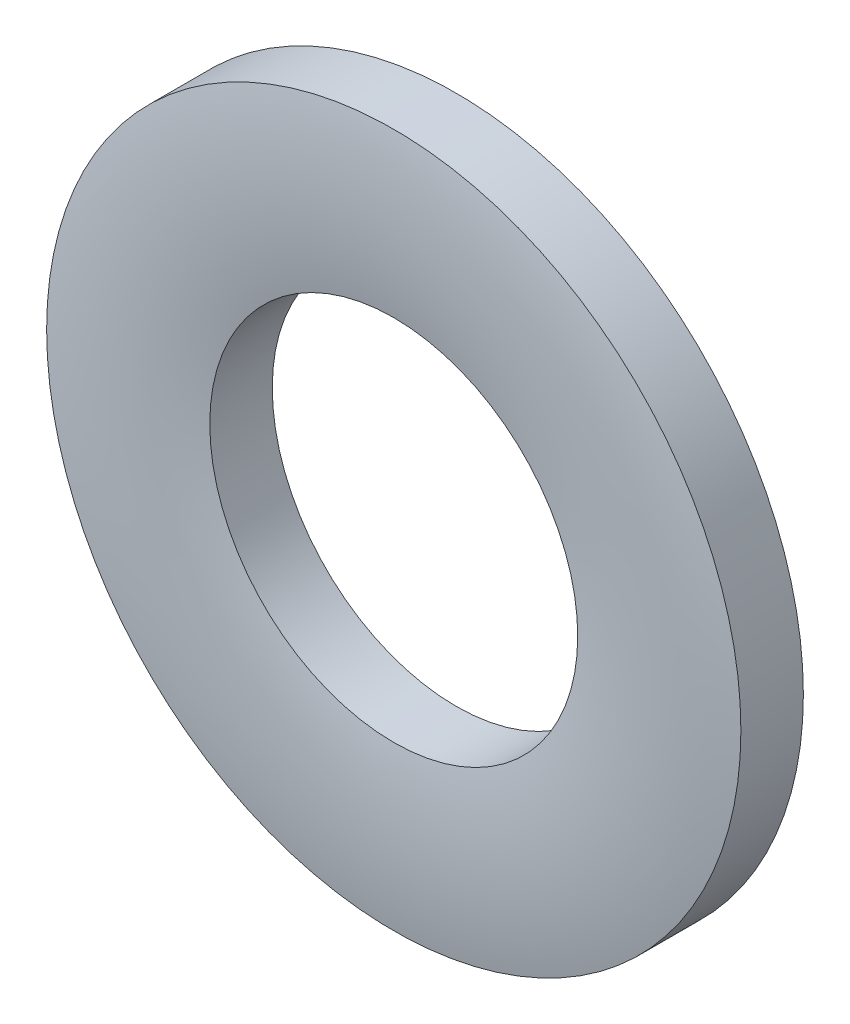
ISO-10303-21;
HEADER;
FILE_DESCRIPTION(('STEP AP214'),'2;1');
FILE_NAME('part.step','',(''),(''),'','','');
FILE_SCHEMA(('AUTOMOTIVE_DESIGN { 1 0 10303 214 1 1 1 1 }'));
ENDSEC;
DATA;
#1=APPLICATION_CONTEXT('core data for automotive mechanical design processes');
#2=APPLICATION_PROTOCOL_DEFINITION('international standard','automotive_design',2000,#1);
#3=PRODUCT_CONTEXT('',#1,'mechanical');
#4=PRODUCT('Part','Part','',(#3));
#5=PRODUCT_RELATED_PRODUCT_CATEGORY('part','',(#4));
#6=PRODUCT_DEFINITION_FORMATION('','',#4);
#7=PRODUCT_DEFINITION_CONTEXT('part definition',#1,'design');
#8=PRODUCT_DEFINITION('design','',#6,#7);
#9=PRODUCT_DEFINITION_SHAPE('','',#8);
#10=(LENGTH_UNIT() NAMED_UNIT(*) SI_UNIT(.MILLI.,.METRE.));
#11=(NAMED_UNIT(*) PLANE_ANGLE_UNIT() SI_UNIT($,.RADIAN.));
#12=(NAMED_UNIT(*) SI_UNIT($,.STERADIAN.) SOLID_ANGLE_UNIT());
#13=UNCERTAINTY_MEASURE_WITH_UNIT(LENGTH_MEASURE(1.E-05),#10,'distance_accuracy_value','');
#14=(GEOMETRIC_REPRESENTATION_CONTEXT(3) GLOBAL_UNCERTAINTY_ASSIGNED_CONTEXT((#13)) GLOBAL_UNIT_ASSIGNED_CONTEXT((#10,
#11,#12)) REPRESENTATION_CONTEXT('',''));
#15=CARTESIAN_POINT('',(0.,0.,0.));
#16=DIRECTION('',(0.,0.,1.));
#17=DIRECTION('',(1.,0.,0.));
#18=AXIS2_PLACEMENT_3D('',#15,#16,#17);
#19=CARTESIAN_POINT('',(0.,2.65,-0.5));
#20=DIRECTION('',(0.,0.,1.));
#21=DIRECTION('',(1.,0.,0.));
#22=AXIS2_PLACEMENT_3D('',#19,#20,#21);
#23=PLANE('',#22);
#24=CARTESIAN_POINT('',(0.,0.,-0.5));
#25=DIRECTION('',(0.,0.,1.));
#26=DIRECTION('',(1.,0.,0.));
#27=AXIS2_PLACEMENT_3D('',#24,#25,#26);
#28=CIRCLE('',#27,5.);
#29=CARTESIAN_POINT('',(5.,0.,-0.5));
#30=VERTEX_POINT('',#29);
#31=EDGE_CURVE('E53',#30,#30,#28,.T.);
#32=ORIENTED_EDGE('',*,*,#31,.F.);
#33=EDGE_LOOP('',(#32));
#34=FACE_BOUND('',#33,.T.);
#35=CARTESIAN_POINT('',(0.,0.,-0.5));
#36=DIRECTION('',(0.,0.,1.));
#37=DIRECTION('',(1.,0.,0.));
#38=AXIS2_PLACEMENT_3D('',#35,#36,#37);
#39=CIRCLE('',#38,2.65);
#40=CARTESIAN_POINT('',(2.65,0.,-0.5));
#41=VERTEX_POINT('',#40);
#42=EDGE_CURVE('E10',#41,#41,#39,.T.);
#43=ORIENTED_EDGE('',*,*,#42,.T.);
#44=EDGE_LOOP('',(#43));
#45=FACE_BOUND('',#44,.T.);
#46=ADVANCED_FACE('F39',(#34,#45),#23,.F.);
#47=CARTESIAN_POINT('',(0.,0.,0.5));
#48=DIRECTION('',(0.,0.,1.));
#49=DIRECTION('',(1.,0.,0.));
#50=AXIS2_PLACEMENT_3D('',#47,#48,#49);
#51=CYLINDRICAL_SURFACE('',#50,2.65);
#52=ORIENTED_EDGE('',*,*,#42,.F.);
#53=EDGE_LOOP('',(#52));
#54=FACE_BOUND('',#53,.T.);
#55=CARTESIAN_POINT('',(0.,0.,0.4));
#56=DIRECTION('',(0.,0.,1.));
#57=DIRECTION('',(1.,0.,0.));
#58=AXIS2_PLACEMENT_3D('',#55,#56,#57);
#59=CIRCLE('',#58,2.65);
#60=CARTESIAN_POINT('',(2.65,0.,0.4));
#61=VERTEX_POINT('',#60);
#62=EDGE_CURVE('E45',#61,#61,#59,.T.);
#63=ORIENTED_EDGE('',*,*,#62,.T.);
#64=EDGE_LOOP('',(#63));
#65=FACE_BOUND('',#64,.T.);
#66=ADVANCED_FACE('F62',(#54,#65),#51,.F.);
#67=CARTESIAN_POINT('',(0.,0.,-6.45312500000001));
#68=DIRECTION('',(0.,0.,1.));
#69=DIRECTION('',(1.,0.,0.));
#70=AXIS2_PLACEMENT_3D('',#67,#68,#69);
#71=DEGENERATE_TOROIDAL_SURFACE('',#70,3.825,6.95312500000001,.T.);
#72=ORIENTED_EDGE('',*,*,#62,.F.);
#73=EDGE_LOOP('',(#72));
#74=FACE_BOUND('',#73,.T.);
#75=CARTESIAN_POINT('',(0.,0.,0.4));
#76=DIRECTION('',(0.,0.,1.));
#77=DIRECTION('',(1.,0.,0.));
#78=AXIS2_PLACEMENT_3D('',#75,#76,#77);
#79=CIRCLE('',#78,5.);
#80=CARTESIAN_POINT('',(5.,0.,0.4));
#81=VERTEX_POINT('',#80);
#82=EDGE_CURVE('E49',#81,#81,#79,.T.);
#83=ORIENTED_EDGE('',*,*,#82,.T.);
#84=EDGE_LOOP('',(#83));
#85=FACE_BOUND('',#84,.T.);
#86=ADVANCED_FACE('F66',(#74,#85),#71,.T.);
#87=CARTESIAN_POINT('',(0.,0.,0.5));
#88=DIRECTION('',(0.,0.,1.));
#89=DIRECTION('',(1.,0.,0.));
#90=AXIS2_PLACEMENT_3D('',#87,#88,#89);
#91=CYLINDRICAL_SURFACE('',#90,5.);
#92=ORIENTED_EDGE('',*,*,#82,.F.);
#93=EDGE_LOOP('',(#92));
#94=FACE_BOUND('',#93,.T.);
#95=ORIENTED_EDGE('',*,*,#31,.T.);
#96=EDGE_LOOP('',(#95));
#97=FACE_BOUND('',#96,.T.);
#98=ADVANCED_FACE('F59',(#94,#97),#91,.T.);
#99=CLOSED_SHELL('',(#46,#66,#86,#98));
#100=MANIFOLD_SOLID_BREP('B2',#99);
#101=ADVANCED_BREP_SHAPE_REPRESENTATION('',(#18,#100),#14);
#102=SHAPE_DEFINITION_REPRESENTATION(#9,#101);
ENDSEC;
END-ISO-10303-21;
